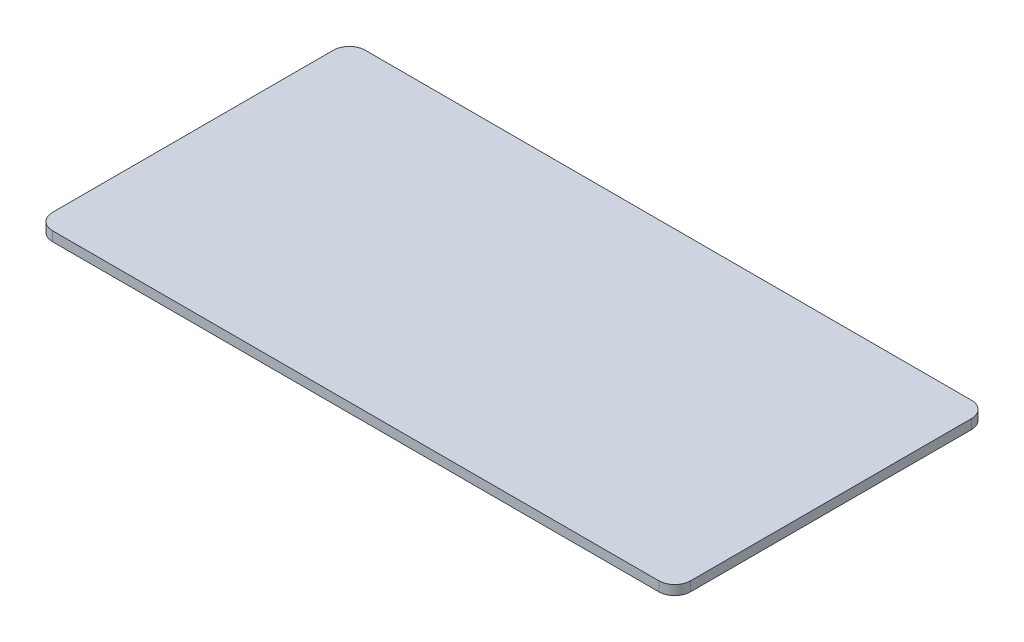
ISO-10303-21;
HEADER;
FILE_DESCRIPTION(('STEP AP214'),'2;1');
FILE_NAME('part.step','',(''),(''),'','','');
FILE_SCHEMA(('AUTOMOTIVE_DESIGN { 1 0 10303 214 1 1 1 1 }'));
ENDSEC;
DATA;
#1=APPLICATION_CONTEXT('core data for automotive mechanical design processes');
#2=APPLICATION_PROTOCOL_DEFINITION('international standard','automotive_design',2000,#1);
#3=PRODUCT_CONTEXT('',#1,'mechanical');
#4=PRODUCT('Part','Part','',(#3));
#5=PRODUCT_RELATED_PRODUCT_CATEGORY('part','',(#4));
#6=PRODUCT_DEFINITION_FORMATION('','',#4);
#7=PRODUCT_DEFINITION_CONTEXT('part definition',#1,'design');
#8=PRODUCT_DEFINITION('design','',#6,#7);
#9=PRODUCT_DEFINITION_SHAPE('','',#8);
#10=(LENGTH_UNIT() NAMED_UNIT(*) SI_UNIT(.MILLI.,.METRE.));
#11=(NAMED_UNIT(*) PLANE_ANGLE_UNIT() SI_UNIT($,.RADIAN.));
#12=(NAMED_UNIT(*) SI_UNIT($,.STERADIAN.) SOLID_ANGLE_UNIT());
#13=UNCERTAINTY_MEASURE_WITH_UNIT(LENGTH_MEASURE(1.E-05),#10,'distance_accuracy_value','');
#14=(GEOMETRIC_REPRESENTATION_CONTEXT(3) GLOBAL_UNCERTAINTY_ASSIGNED_CONTEXT((#13)) GLOBAL_UNIT_ASSIGNED_CONTEXT((#10,
#11,#12)) REPRESENTATION_CONTEXT('',''));
#15=CARTESIAN_POINT('',(0.,0.,0.));
#16=DIRECTION('',(0.,0.,1.));
#17=DIRECTION('',(1.,0.,0.));
#18=AXIS2_PLACEMENT_3D('',#15,#16,#17);
#19=CARTESIAN_POINT('',(44.4505494505495,3.,-74.8534798534799));
#20=DIRECTION('',(0.,-1.,0.));
#21=DIRECTION('',(0.,0.,-1.));
#22=AXIS2_PLACEMENT_3D('',#19,#20,#21);
#23=CYLINDRICAL_SURFACE('',#22,5.);
#24=CARTESIAN_POINT('',(44.4505494505495,0.,-74.8534798534799));
#25=DIRECTION('',(0.,1.,0.));
#26=DIRECTION('',(0.,0.,1.));
#27=AXIS2_PLACEMENT_3D('',#24,#25,#26);
#28=CIRCLE('',#27,5.);
#29=CARTESIAN_POINT('',(49.4505494505494,0.,-74.8534798534798));
#30=VERTEX_POINT('',#29);
#31=CARTESIAN_POINT('',(44.4505494505494,0.,-79.8534798534799));
#32=VERTEX_POINT('',#31);
#33=EDGE_CURVE('E137',#30,#32,#28,.T.);
#34=ORIENTED_EDGE('',*,*,#33,.T.);
#35=DIRECTION('',(0.,-1.,0.));
#36=VECTOR('',#35,1.);
#37=CARTESIAN_POINT('',(44.4505494505494,3.,-79.8534798534799));
#38=LINE('',#37,#36);
#39=CARTESIAN_POINT('',(44.4505494505494,3.,-79.8534798534799));
#40=VERTEX_POINT('',#39);
#41=EDGE_CURVE('E11',#40,#32,#38,.T.);
#42=ORIENTED_EDGE('',*,*,#41,.F.);
#43=CARTESIAN_POINT('',(44.4505494505495,3.,-74.8534798534799));
#44=DIRECTION('',(0.,1.,0.));
#45=DIRECTION('',(0.,0.,1.));
#46=AXIS2_PLACEMENT_3D('',#43,#44,#45);
#47=CIRCLE('',#46,5.);
#48=CARTESIAN_POINT('',(49.4505494505494,3.,-74.8534798534798));
#49=VERTEX_POINT('',#48);
#50=EDGE_CURVE('E151',#49,#40,#47,.T.);
#51=ORIENTED_EDGE('',*,*,#50,.F.);
#52=DIRECTION('',(0.,-1.,0.));
#53=VECTOR('',#52,1.);
#54=CARTESIAN_POINT('',(49.4505494505494,3.,-74.8534798534798));
#55=LINE('',#54,#53);
#56=EDGE_CURVE('E133',#49,#30,#55,.T.);
#57=ORIENTED_EDGE('',*,*,#56,.T.);
#58=EDGE_LOOP('',(#34,#42,#51,#57));
#59=FACE_BOUND('',#58,.T.);
#60=ADVANCED_FACE('F41',(#59),#23,.T.);
#61=CARTESIAN_POINT('',(44.4505494505494,3.,-79.8534798534799));
#62=DIRECTION('',(0.,0.,1.));
#63=DIRECTION('',(1.,0.,0.));
#64=AXIS2_PLACEMENT_3D('',#61,#62,#63);
#65=PLANE('',#64);
#66=DIRECTION('',(-1.,0.,0.));
#67=VECTOR('',#66,1.);
#68=CARTESIAN_POINT('',(44.4505494505494,0.,-79.8534798534799));
#69=LINE('',#68,#67);
#70=CARTESIAN_POINT('',(-145.549450549451,0.,-79.8534798534799));
#71=VERTEX_POINT('',#70);
#72=EDGE_CURVE('E140',#32,#71,#69,.T.);
#73=ORIENTED_EDGE('',*,*,#72,.T.);
#74=DIRECTION('',(0.,-1.,0.));
#75=VECTOR('',#74,1.);
#76=CARTESIAN_POINT('',(-145.549450549451,3.,-79.8534798534799));
#77=LINE('',#76,#75);
#78=CARTESIAN_POINT('',(-145.549450549451,3.,-79.8534798534799));
#79=VERTEX_POINT('',#78);
#80=EDGE_CURVE('E49',#79,#71,#77,.T.);
#81=ORIENTED_EDGE('',*,*,#80,.F.);
#82=DIRECTION('',(-1.,0.,0.));
#83=VECTOR('',#82,1.);
#84=CARTESIAN_POINT('',(44.4505494505494,3.,-79.8534798534799));
#85=LINE('',#84,#83);
#86=EDGE_CURVE('E100',#40,#79,#85,.T.);
#87=ORIENTED_EDGE('',*,*,#86,.F.);
#88=ORIENTED_EDGE('',*,*,#41,.T.);
#89=EDGE_LOOP('',(#73,#81,#87,#88));
#90=FACE_BOUND('',#89,.T.);
#91=ADVANCED_FACE('F186',(#90),#65,.F.);
#92=CARTESIAN_POINT('',(-145.549450549451,3.,-74.8534798534799));
#93=DIRECTION('',(0.,-1.,0.));
#94=DIRECTION('',(0.,0.,-1.));
#95=AXIS2_PLACEMENT_3D('',#92,#93,#94);
#96=CYLINDRICAL_SURFACE('',#95,5.);
#97=CARTESIAN_POINT('',(-145.549450549451,0.,-74.8534798534799));
#98=DIRECTION('',(0.,1.,0.));
#99=DIRECTION('',(0.,0.,1.));
#100=AXIS2_PLACEMENT_3D('',#97,#98,#99);
#101=CIRCLE('',#100,5.);
#102=CARTESIAN_POINT('',(-150.549450549451,0.,-74.8534798534798));
#103=VERTEX_POINT('',#102);
#104=EDGE_CURVE('E142',#71,#103,#101,.T.);
#105=ORIENTED_EDGE('',*,*,#104,.T.);
#106=DIRECTION('',(0.,-1.,0.));
#107=VECTOR('',#106,1.);
#108=CARTESIAN_POINT('',(-150.549450549451,3.,-74.8534798534798));
#109=LINE('',#108,#107);
#110=CARTESIAN_POINT('',(-150.549450549451,3.,-74.8534798534798));
#111=VERTEX_POINT('',#110);
#112=EDGE_CURVE('E158',#111,#103,#109,.T.);
#113=ORIENTED_EDGE('',*,*,#112,.F.);
#114=CARTESIAN_POINT('',(-145.549450549451,3.,-74.8534798534799));
#115=DIRECTION('',(0.,1.,0.));
#116=DIRECTION('',(0.,0.,1.));
#117=AXIS2_PLACEMENT_3D('',#114,#115,#116);
#118=CIRCLE('',#117,5.);
#119=EDGE_CURVE('E166',#79,#111,#118,.T.);
#120=ORIENTED_EDGE('',*,*,#119,.F.);
#121=ORIENTED_EDGE('',*,*,#80,.T.);
#122=EDGE_LOOP('',(#105,#113,#120,#121));
#123=FACE_BOUND('',#122,.T.);
#124=ADVANCED_FACE('F164',(#123),#96,.T.);
#125=CARTESIAN_POINT('',(-150.549450549451,3.,13.1465201465201));
#126=DIRECTION('',(1.,0.,0.));
#127=DIRECTION('',(0.,0.,-1.));
#128=AXIS2_PLACEMENT_3D('',#125,#126,#127);
#129=PLANE('',#128);
#130=DIRECTION('',(0.,0.,1.));
#131=VECTOR('',#130,1.);
#132=CARTESIAN_POINT('',(-150.549450549451,0.,13.1465201465201));
#133=LINE('',#132,#131);
#134=CARTESIAN_POINT('',(-150.549450549451,0.,13.1465201465201));
#135=VERTEX_POINT('',#134);
#136=EDGE_CURVE('E144',#103,#135,#133,.T.);
#137=ORIENTED_EDGE('',*,*,#136,.T.);
#138=DIRECTION('',(0.,-1.,0.));
#139=VECTOR('',#138,1.);
#140=CARTESIAN_POINT('',(-150.549450549451,3.,13.1465201465201));
#141=LINE('',#140,#139);
#142=CARTESIAN_POINT('',(-150.549450549451,3.,13.1465201465201));
#143=VERTEX_POINT('',#142);
#144=EDGE_CURVE('E155',#143,#135,#141,.T.);
#145=ORIENTED_EDGE('',*,*,#144,.F.);
#146=DIRECTION('',(0.,0.,1.));
#147=VECTOR('',#146,1.);
#148=CARTESIAN_POINT('',(-150.549450549451,3.,13.1465201465201));
#149=LINE('',#148,#147);
#150=EDGE_CURVE('E178',#111,#143,#149,.T.);
#151=ORIENTED_EDGE('',*,*,#150,.F.);
#152=ORIENTED_EDGE('',*,*,#112,.T.);
#153=EDGE_LOOP('',(#137,#145,#151,#152));
#154=FACE_BOUND('',#153,.T.);
#155=ADVANCED_FACE('F174',(#154),#129,.F.);
#156=CARTESIAN_POINT('',(-145.549450549451,3.,13.1465201465201));
#157=DIRECTION('',(0.,-1.,0.));
#158=DIRECTION('',(0.,0.,-1.));
#159=AXIS2_PLACEMENT_3D('',#156,#157,#158);
#160=CYLINDRICAL_SURFACE('',#159,5.);
#161=CARTESIAN_POINT('',(-145.549450549451,0.,13.1465201465201));
#162=DIRECTION('',(0.,1.,0.));
#163=DIRECTION('',(0.,0.,-1.));
#164=AXIS2_PLACEMENT_3D('',#161,#162,#163);
#165=CIRCLE('',#164,5.);
#166=CARTESIAN_POINT('',(-145.549450549451,0.,18.1465201465201));
#167=VERTEX_POINT('',#166);
#168=EDGE_CURVE('E146',#135,#167,#165,.T.);
#169=ORIENTED_EDGE('',*,*,#168,.T.);
#170=DIRECTION('',(0.,-1.,0.));
#171=VECTOR('',#170,1.);
#172=CARTESIAN_POINT('',(-145.549450549451,3.,18.1465201465201));
#173=LINE('',#172,#171);
#174=CARTESIAN_POINT('',(-145.549450549451,3.,18.1465201465201));
#175=VERTEX_POINT('',#174);
#176=EDGE_CURVE('E128',#175,#167,#173,.T.);
#177=ORIENTED_EDGE('',*,*,#176,.F.);
#178=CARTESIAN_POINT('',(-145.549450549451,3.,13.1465201465201));
#179=DIRECTION('',(0.,1.,0.));
#180=DIRECTION('',(0.,0.,-1.));
#181=AXIS2_PLACEMENT_3D('',#178,#179,#180);
#182=CIRCLE('',#181,5.);
#183=EDGE_CURVE('E119',#143,#175,#182,.T.);
#184=ORIENTED_EDGE('',*,*,#183,.F.);
#185=ORIENTED_EDGE('',*,*,#144,.T.);
#186=EDGE_LOOP('',(#169,#177,#184,#185));
#187=FACE_BOUND('',#186,.T.);
#188=ADVANCED_FACE('F177',(#187),#160,.T.);
#189=CARTESIAN_POINT('',(44.4505494505494,3.,18.1465201465201));
#190=DIRECTION('',(0.,0.,-1.));
#191=DIRECTION('',(-1.,0.,0.));
#192=AXIS2_PLACEMENT_3D('',#189,#190,#191);
#193=PLANE('',#192);
#194=DIRECTION('',(1.,0.,0.));
#195=VECTOR('',#194,1.);
#196=CARTESIAN_POINT('',(44.4505494505494,0.,18.1465201465201));
#197=LINE('',#196,#195);
#198=CARTESIAN_POINT('',(44.4505494505494,0.,18.1465201465201));
#199=VERTEX_POINT('',#198);
#200=EDGE_CURVE('E127',#167,#199,#197,.T.);
#201=ORIENTED_EDGE('',*,*,#200,.T.);
#202=DIRECTION('',(0.,-1.,0.));
#203=VECTOR('',#202,1.);
#204=CARTESIAN_POINT('',(44.4505494505494,3.,18.1465201465201));
#205=LINE('',#204,#203);
#206=CARTESIAN_POINT('',(44.4505494505494,3.,18.1465201465201));
#207=VERTEX_POINT('',#206);
#208=EDGE_CURVE('E124',#207,#199,#205,.T.);
#209=ORIENTED_EDGE('',*,*,#208,.F.);
#210=DIRECTION('',(1.,0.,0.));
#211=VECTOR('',#210,1.);
#212=CARTESIAN_POINT('',(44.4505494505494,3.,18.1465201465201));
#213=LINE('',#212,#211);
#214=EDGE_CURVE('E113',#175,#207,#213,.T.);
#215=ORIENTED_EDGE('',*,*,#214,.F.);
#216=ORIENTED_EDGE('',*,*,#176,.T.);
#217=EDGE_LOOP('',(#201,#209,#215,#216));
#218=FACE_BOUND('',#217,.T.);
#219=ADVANCED_FACE('F125',(#218),#193,.F.);
#220=CARTESIAN_POINT('',(44.4505494505494,3.,13.1465201465201));
#221=DIRECTION('',(0.,-1.,0.));
#222=DIRECTION('',(0.,0.,-1.));
#223=AXIS2_PLACEMENT_3D('',#220,#221,#222);
#224=CYLINDRICAL_SURFACE('',#223,5.);
#225=CARTESIAN_POINT('',(44.4505494505494,0.,13.1465201465201));
#226=DIRECTION('',(0.,1.,0.));
#227=DIRECTION('',(0.,0.,1.));
#228=AXIS2_PLACEMENT_3D('',#225,#226,#227);
#229=CIRCLE('',#228,5.);
#230=CARTESIAN_POINT('',(49.4505494505494,0.,13.1465201465201));
#231=VERTEX_POINT('',#230);
#232=EDGE_CURVE('E86',#199,#231,#229,.T.);
#233=ORIENTED_EDGE('',*,*,#232,.T.);
#234=DIRECTION('',(0.,-1.,0.));
#235=VECTOR('',#234,1.);
#236=CARTESIAN_POINT('',(49.4505494505494,3.,13.1465201465201));
#237=LINE('',#236,#235);
#238=CARTESIAN_POINT('',(49.4505494505494,3.,13.1465201465201));
#239=VERTEX_POINT('',#238);
#240=EDGE_CURVE('E129',#239,#231,#237,.T.);
#241=ORIENTED_EDGE('',*,*,#240,.F.);
#242=CARTESIAN_POINT('',(44.4505494505494,3.,13.1465201465201));
#243=DIRECTION('',(0.,1.,0.));
#244=DIRECTION('',(0.,0.,1.));
#245=AXIS2_PLACEMENT_3D('',#242,#243,#244);
#246=CIRCLE('',#245,5.);
#247=EDGE_CURVE('E117',#207,#239,#246,.T.);
#248=ORIENTED_EDGE('',*,*,#247,.F.);
#249=ORIENTED_EDGE('',*,*,#208,.T.);
#250=EDGE_LOOP('',(#233,#241,#248,#249));
#251=FACE_BOUND('',#250,.T.);
#252=ADVANCED_FACE('F131',(#251),#224,.T.);
#253=CARTESIAN_POINT('',(49.4505494505494,3.,13.1465201465201));
#254=DIRECTION('',(-1.,0.,0.));
#255=DIRECTION('',(0.,0.,1.));
#256=AXIS2_PLACEMENT_3D('',#253,#254,#255);
#257=PLANE('',#256);
#258=DIRECTION('',(0.,0.,-1.));
#259=VECTOR('',#258,1.);
#260=CARTESIAN_POINT('',(49.4505494505494,0.,13.1465201465201));
#261=LINE('',#260,#259);
#262=EDGE_CURVE('E92',#231,#30,#261,.T.);
#263=ORIENTED_EDGE('',*,*,#262,.T.);
#264=ORIENTED_EDGE('',*,*,#56,.F.);
#265=DIRECTION('',(0.,0.,-1.));
#266=VECTOR('',#265,1.);
#267=CARTESIAN_POINT('',(49.4505494505494,3.,13.1465201465201));
#268=LINE('',#267,#266);
#269=EDGE_CURVE('E57',#239,#49,#268,.T.);
#270=ORIENTED_EDGE('',*,*,#269,.F.);
#271=ORIENTED_EDGE('',*,*,#240,.T.);
#272=EDGE_LOOP('',(#263,#264,#270,#271));
#273=FACE_BOUND('',#272,.T.);
#274=ADVANCED_FACE('F202',(#273),#257,.F.);
#275=CARTESIAN_POINT('',(44.4505494505495,3.,-74.8534798534799));
#276=DIRECTION('',(0.,1.,0.));
#277=DIRECTION('',(0.,0.,1.));
#278=AXIS2_PLACEMENT_3D('',#275,#276,#277);
#279=PLANE('',#278);
#280=ORIENTED_EDGE('',*,*,#50,.T.);
#281=ORIENTED_EDGE('',*,*,#86,.T.);
#282=ORIENTED_EDGE('',*,*,#119,.T.);
#283=ORIENTED_EDGE('',*,*,#150,.T.);
#284=ORIENTED_EDGE('',*,*,#183,.T.);
#285=ORIENTED_EDGE('',*,*,#214,.T.);
#286=ORIENTED_EDGE('',*,*,#247,.T.);
#287=ORIENTED_EDGE('',*,*,#269,.T.);
#288=EDGE_LOOP('',(#280,#281,#282,#283,#284,#285,#286,#287));
#289=FACE_BOUND('',#288,.T.);
#290=ADVANCED_FACE('F115',(#289),#279,.T.);
#291=CARTESIAN_POINT('',(44.4505494505495,0.,-74.8534798534799));
#292=DIRECTION('',(0.,1.,0.));
#293=DIRECTION('',(0.,0.,1.));
#294=AXIS2_PLACEMENT_3D('',#291,#292,#293);
#295=PLANE('',#294);
#296=ORIENTED_EDGE('',*,*,#33,.F.);
#297=ORIENTED_EDGE('',*,*,#262,.F.);
#298=ORIENTED_EDGE('',*,*,#232,.F.);
#299=ORIENTED_EDGE('',*,*,#200,.F.);
#300=ORIENTED_EDGE('',*,*,#168,.F.);
#301=ORIENTED_EDGE('',*,*,#136,.F.);
#302=ORIENTED_EDGE('',*,*,#104,.F.);
#303=ORIENTED_EDGE('',*,*,#72,.F.);
#304=EDGE_LOOP('',(#296,#297,#298,#299,#300,#301,#302,#303));
#305=FACE_BOUND('',#304,.T.);
#306=ADVANCED_FACE('F170',(#305),#295,.F.);
#307=CLOSED_SHELL('',(#60,#91,#124,#155,#188,#219,#252,#274,#290,#306));
#308=MANIFOLD_SOLID_BREP('B2',#307);
#309=ADVANCED_BREP_SHAPE_REPRESENTATION('',(#18,#308),#14);
#310=SHAPE_DEFINITION_REPRESENTATION(#9,#309);
ENDSEC;
END-ISO-10303-21;
